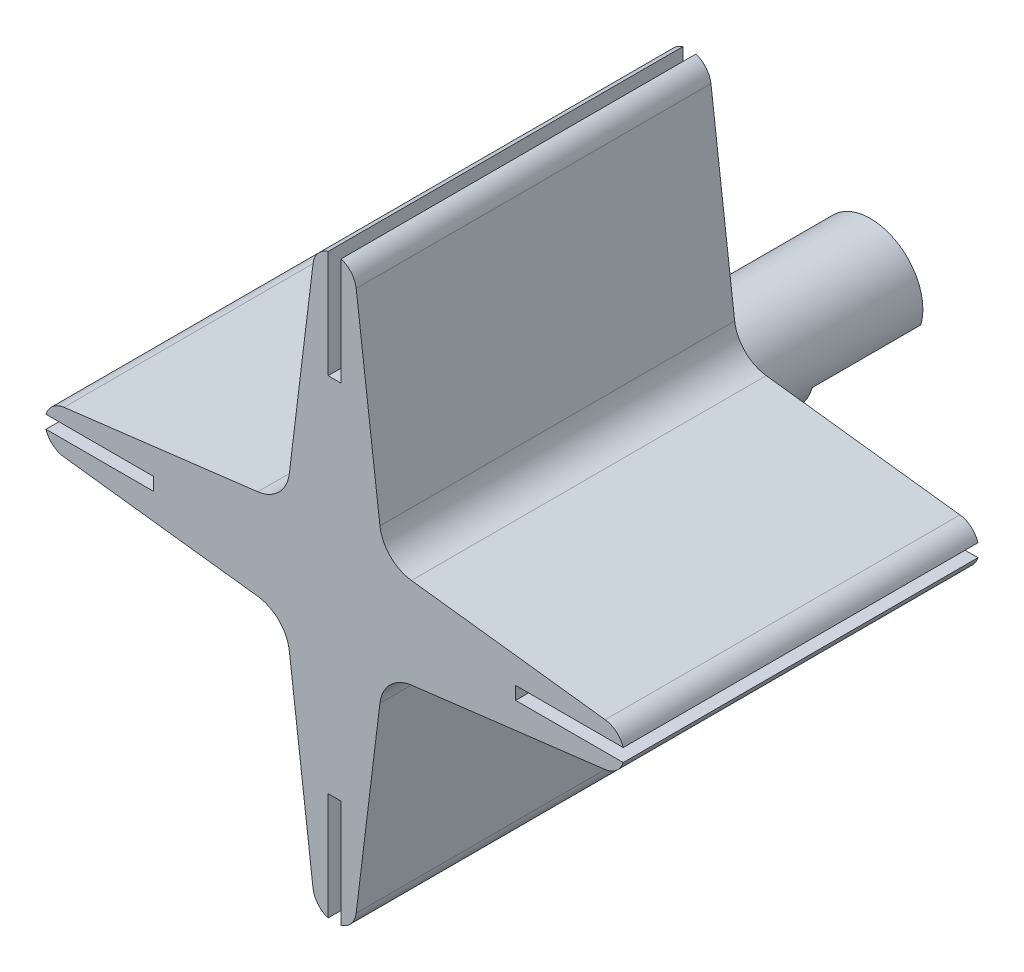
ISO-10303-21;
HEADER;
FILE_DESCRIPTION(('STEP AP214'),'2;1');
FILE_NAME('part.step','',(''),(''),'','','');
FILE_SCHEMA(('AUTOMOTIVE_DESIGN { 1 0 10303 214 1 1 1 1 }'));
ENDSEC;
DATA;
#1=APPLICATION_CONTEXT('core data for automotive mechanical design processes');
#2=APPLICATION_PROTOCOL_DEFINITION('international standard','automotive_design',2000,#1);
#3=PRODUCT_CONTEXT('',#1,'mechanical');
#4=PRODUCT('Part','Part','',(#3));
#5=PRODUCT_RELATED_PRODUCT_CATEGORY('part','',(#4));
#6=PRODUCT_DEFINITION_FORMATION('','',#4);
#7=PRODUCT_DEFINITION_CONTEXT('part definition',#1,'design');
#8=PRODUCT_DEFINITION('design','',#6,#7);
#9=PRODUCT_DEFINITION_SHAPE('','',#8);
#10=(LENGTH_UNIT() NAMED_UNIT(*) SI_UNIT(.MILLI.,.METRE.));
#11=(NAMED_UNIT(*) PLANE_ANGLE_UNIT() SI_UNIT($,.RADIAN.));
#12=(NAMED_UNIT(*) SI_UNIT($,.STERADIAN.) SOLID_ANGLE_UNIT());
#13=UNCERTAINTY_MEASURE_WITH_UNIT(LENGTH_MEASURE(1.E-05),#10,'distance_accuracy_value','');
#14=(GEOMETRIC_REPRESENTATION_CONTEXT(3) GLOBAL_UNCERTAINTY_ASSIGNED_CONTEXT((#13)) GLOBAL_UNIT_ASSIGNED_CONTEXT((#10,
#11,#12)) REPRESENTATION_CONTEXT('',''));
#15=CARTESIAN_POINT('',(0.,0.,0.));
#16=DIRECTION('',(0.,0.,1.));
#17=DIRECTION('',(1.,0.,0.));
#18=AXIS2_PLACEMENT_3D('',#15,#16,#17);
#19=CARTESIAN_POINT('',(-37.,0.,49.));
#20=DIRECTION('',(0.,0.,-1.));
#21=DIRECTION('',(-1.,0.,0.));
#22=AXIS2_PLACEMENT_3D('',#19,#20,#21);
#23=CYLINDRICAL_SURFACE('',#22,3.);
#24=DIRECTION('',(0.,0.,-1.));
#25=VECTOR('',#24,1.);
#26=CARTESIAN_POINT('',(-39.8637756437095,0.893749999997804,49.));
#27=LINE('',#26,#25);
#28=CARTESIAN_POINT('',(-39.8637756437095,0.893749999997805,49.));
#29=VERTEX_POINT('',#28);
#30=CARTESIAN_POINT('',(-39.8637756437095,0.893749999997805,0.));
#31=VERTEX_POINT('',#30);
#32=EDGE_CURVE('E340',#29,#31,#27,.T.);
#33=ORIENTED_EDGE('',*,*,#32,.F.);
#34=CARTESIAN_POINT('',(-37.,0.,49.));
#35=DIRECTION('',(0.,0.,1.));
#36=DIRECTION('',(1.,0.,0.));
#37=AXIS2_PLACEMENT_3D('',#34,#35,#36);
#38=CIRCLE('',#37,3.);
#39=CARTESIAN_POINT('',(-37.3648648648649,2.97772961001954,49.));
#40=VERTEX_POINT('',#39);
#41=EDGE_CURVE('E373',#29,#40,#38,.F.);
#42=ORIENTED_EDGE('',*,*,#41,.T.);
#43=DIRECTION('',(0.,0.,-1.));
#44=VECTOR('',#43,1.);
#45=CARTESIAN_POINT('',(-37.3648648648649,2.97772961001954,49.));
#46=LINE('',#45,#44);
#47=CARTESIAN_POINT('',(-37.3648648648649,2.97772961001954,0.));
#48=VERTEX_POINT('',#47);
#49=EDGE_CURVE('E404',#40,#48,#46,.T.);
#50=ORIENTED_EDGE('',*,*,#49,.T.);
#51=CARTESIAN_POINT('',(-37.,0.,0.));
#52=DIRECTION('',(0.,0.,1.));
#53=DIRECTION('',(1.,0.,0.));
#54=AXIS2_PLACEMENT_3D('',#51,#52,#53);
#55=CIRCLE('',#54,3.);
#56=EDGE_CURVE('E368',#31,#48,#55,.F.);
#57=ORIENTED_EDGE('',*,*,#56,.F.);
#58=EDGE_LOOP('',(#33,#42,#50,#57));
#59=FACE_BOUND('',#58,.T.);
#60=ADVANCED_FACE('F41',(#59),#23,.T.);
#61=CARTESIAN_POINT('',(0.,-37.,49.));
#62=DIRECTION('',(0.,0.,-1.));
#63=DIRECTION('',(-1.,0.,0.));
#64=AXIS2_PLACEMENT_3D('',#61,#62,#63);
#65=CYLINDRICAL_SURFACE('',#64,3.);
#66=DIRECTION('',(0.,0.,-1.));
#67=VECTOR('',#66,1.);
#68=CARTESIAN_POINT('',(-0.89374999999544,-39.8637756437103,49.));
#69=LINE('',#68,#67);
#70=CARTESIAN_POINT('',(-0.89374999999544,-39.8637756437103,49.));
#71=VERTEX_POINT('',#70);
#72=CARTESIAN_POINT('',(-0.89374999999544,-39.8637756437103,0.));
#73=VERTEX_POINT('',#72);
#74=EDGE_CURVE('E344',#71,#73,#69,.T.);
#75=ORIENTED_EDGE('',*,*,#74,.F.);
#76=CARTESIAN_POINT('',(0.,-37.,49.));
#77=DIRECTION('',(0.,0.,1.));
#78=DIRECTION('',(1.,0.,0.));
#79=AXIS2_PLACEMENT_3D('',#76,#77,#78);
#80=CIRCLE('',#79,3.);
#81=CARTESIAN_POINT('',(-2.97772961001954,-37.3648648648649,49.));
#82=VERTEX_POINT('',#81);
#83=EDGE_CURVE('E378',#71,#82,#80,.F.);
#84=ORIENTED_EDGE('',*,*,#83,.T.);
#85=DIRECTION('',(0.,0.,-1.));
#86=VECTOR('',#85,1.);
#87=CARTESIAN_POINT('',(-2.97772961001954,-37.3648648648649,49.));
#88=LINE('',#87,#86);
#89=CARTESIAN_POINT('',(-2.97772961001954,-37.3648648648649,0.));
#90=VERTEX_POINT('',#89);
#91=EDGE_CURVE('E457',#82,#90,#88,.T.);
#92=ORIENTED_EDGE('',*,*,#91,.T.);
#93=CARTESIAN_POINT('',(0.,-37.,0.));
#94=DIRECTION('',(0.,0.,1.));
#95=DIRECTION('',(1.,0.,0.));
#96=AXIS2_PLACEMENT_3D('',#93,#94,#95);
#97=CIRCLE('',#96,3.);
#98=EDGE_CURVE('E413',#73,#90,#97,.F.);
#99=ORIENTED_EDGE('',*,*,#98,.F.);
#100=EDGE_LOOP('',(#75,#84,#92,#99));
#101=FACE_BOUND('',#100,.T.);
#102=ADVANCED_FACE('F555',(#101),#65,.T.);
#103=CARTESIAN_POINT('',(37.,0.,49.));
#104=DIRECTION('',(0.,0.,-1.));
#105=DIRECTION('',(-1.,0.,0.));
#106=AXIS2_PLACEMENT_3D('',#103,#104,#105);
#107=CYLINDRICAL_SURFACE('',#106,3.);
#108=DIRECTION('',(0.,0.,-1.));
#109=VECTOR('',#108,1.);
#110=CARTESIAN_POINT('',(39.8637756437096,-0.893749999997629,49.));
#111=LINE('',#110,#109);
#112=CARTESIAN_POINT('',(39.8637756437096,-0.893749999997629,49.));
#113=VERTEX_POINT('',#112);
#114=CARTESIAN_POINT('',(39.8637756437096,-0.893749999997629,0.));
#115=VERTEX_POINT('',#114);
#116=EDGE_CURVE('E348',#113,#115,#111,.T.);
#117=ORIENTED_EDGE('',*,*,#116,.F.);
#118=CARTESIAN_POINT('',(37.,0.,49.));
#119=DIRECTION('',(0.,0.,1.));
#120=DIRECTION('',(1.,0.,0.));
#121=AXIS2_PLACEMENT_3D('',#118,#119,#120);
#122=CIRCLE('',#121,3.);
#123=CARTESIAN_POINT('',(37.3648648648649,-2.97772961001954,49.));
#124=VERTEX_POINT('',#123);
#125=EDGE_CURVE('E387',#113,#124,#122,.F.);
#126=ORIENTED_EDGE('',*,*,#125,.T.);
#127=DIRECTION('',(0.,0.,-1.));
#128=VECTOR('',#127,1.);
#129=CARTESIAN_POINT('',(37.3648648648649,-2.97772961001954,49.));
#130=LINE('',#129,#128);
#131=CARTESIAN_POINT('',(37.3648648648649,-2.97772961001954,0.));
#132=VERTEX_POINT('',#131);
#133=EDGE_CURVE('E451',#124,#132,#130,.T.);
#134=ORIENTED_EDGE('',*,*,#133,.T.);
#135=CARTESIAN_POINT('',(37.,0.,0.));
#136=DIRECTION('',(0.,0.,1.));
#137=DIRECTION('',(1.,0.,0.));
#138=AXIS2_PLACEMENT_3D('',#135,#136,#137);
#139=CIRCLE('',#138,3.);
#140=EDGE_CURVE('E422',#115,#132,#139,.F.);
#141=ORIENTED_EDGE('',*,*,#140,.F.);
#142=EDGE_LOOP('',(#117,#126,#134,#141));
#143=FACE_BOUND('',#142,.T.);
#144=ADVANCED_FACE('F518',(#143),#107,.T.);
#145=CARTESIAN_POINT('',(0.,37.,49.));
#146=DIRECTION('',(0.,0.,-1.));
#147=DIRECTION('',(-1.,0.,0.));
#148=AXIS2_PLACEMENT_3D('',#145,#146,#147);
#149=CYLINDRICAL_SURFACE('',#148,3.);
#150=DIRECTION('',(0.,0.,-1.));
#151=VECTOR('',#150,1.);
#152=CARTESIAN_POINT('',(-0.893749999999999,39.8637756437088,49.));
#153=LINE('',#152,#151);
#154=CARTESIAN_POINT('',(-0.893749999999999,39.8637756437088,0.));
#155=VERTEX_POINT('',#154);
#156=CARTESIAN_POINT('',(-0.893749999999999,39.8637756437088,49.));
#157=VERTEX_POINT('',#156);
#158=EDGE_CURVE('E268',#155,#157,#153,.F.);
#159=ORIENTED_EDGE('',*,*,#158,.F.);
#160=CARTESIAN_POINT('',(0.,37.,0.));
#161=DIRECTION('',(0.,0.,1.));
#162=DIRECTION('',(1.,0.,0.));
#163=AXIS2_PLACEMENT_3D('',#160,#161,#162);
#164=CIRCLE('',#163,3.);
#165=CARTESIAN_POINT('',(-2.97772961001954,37.3648648648649,0.));
#166=VERTEX_POINT('',#165);
#167=EDGE_CURVE('E432',#166,#155,#164,.F.);
#168=ORIENTED_EDGE('',*,*,#167,.F.);
#169=DIRECTION('',(0.,0.,-1.));
#170=VECTOR('',#169,1.);
#171=CARTESIAN_POINT('',(-2.97772961001954,37.3648648648649,49.));
#172=LINE('',#171,#170);
#173=CARTESIAN_POINT('',(-2.97772961001954,37.3648648648649,49.));
#174=VERTEX_POINT('',#173);
#175=EDGE_CURVE('E442',#174,#166,#172,.T.);
#176=ORIENTED_EDGE('',*,*,#175,.F.);
#177=CARTESIAN_POINT('',(0.,37.,49.));
#178=DIRECTION('',(0.,0.,1.));
#179=DIRECTION('',(1.,0.,0.));
#180=AXIS2_PLACEMENT_3D('',#177,#178,#179);
#181=CIRCLE('',#180,3.);
#182=EDGE_CURVE('E397',#174,#157,#181,.F.);
#183=ORIENTED_EDGE('',*,*,#182,.T.);
#184=EDGE_LOOP('',(#159,#168,#176,#183));
#185=FACE_BOUND('',#184,.T.);
#186=ADVANCED_FACE('F610',(#185),#149,.T.);
#187=DIRECTION('',(0.,0.,-1.));
#188=VECTOR('',#187,1.);
#189=CARTESIAN_POINT('',(-39.8637756437082,-0.893750000002193,49.));
#190=LINE('',#189,#188);
#191=CARTESIAN_POINT('',(-39.8637756437082,-0.893750000002193,0.));
#192=VERTEX_POINT('',#191);
#193=CARTESIAN_POINT('',(-39.8637756437082,-0.893750000002193,49.));
#194=VERTEX_POINT('',#193);
#195=EDGE_CURVE('E291',#192,#194,#190,.F.);
#196=ORIENTED_EDGE('',*,*,#195,.F.);
#197=CARTESIAN_POINT('',(-37.3648648648649,-2.97772961001955,0.));
#198=VERTEX_POINT('',#197);
#199=EDGE_CURVE('E405',#198,#192,#55,.F.);
#200=ORIENTED_EDGE('',*,*,#199,.F.);
#201=DIRECTION('',(0.,0.,-1.));
#202=VECTOR('',#201,1.);
#203=CARTESIAN_POINT('',(-37.3648648648649,-2.97772961001955,49.));
#204=LINE('',#203,#202);
#205=CARTESIAN_POINT('',(-37.3648648648649,-2.97772961001955,49.));
#206=VERTEX_POINT('',#205);
#207=EDGE_CURVE('E460',#206,#198,#204,.T.);
#208=ORIENTED_EDGE('',*,*,#207,.F.);
#209=EDGE_CURVE('E369',#206,#194,#38,.F.);
#210=ORIENTED_EDGE('',*,*,#209,.T.);
#211=EDGE_LOOP('',(#196,#200,#208,#210));
#212=FACE_BOUND('',#211,.T.);
#213=ADVANCED_FACE('F577',(#212),#23,.T.);
#214=CARTESIAN_POINT('',(-0.91216216216216,-7.44432402504886,49.));
#215=DIRECTION('',(-0.121621621621621,-0.992576536673181,0.));
#216=DIRECTION('',(0.992576536673181,-0.121621621621621,0.));
#217=AXIS2_PLACEMENT_3D('',#214,#215,#216);
#218=PLANE('',#217);
#219=DIRECTION('',(-0.992576536673181,0.121621621621621,0.));
#220=VECTOR('',#219,1.);
#221=CARTESIAN_POINT('',(-0.91216216216216,-7.44432402504886,0.));
#222=LINE('',#221,#220);
#223=CARTESIAN_POINT('',(-10.610722139404,-6.25594756414619,0.));
#224=VERTEX_POINT('',#223);
#225=EDGE_CURVE('E408',#224,#198,#222,.T.);
#226=ORIENTED_EDGE('',*,*,#225,.F.);
#227=DIRECTION('',(0.,0.,-1.));
#228=VECTOR('',#227,1.);
#229=CARTESIAN_POINT('',(-10.610722139404,-6.25594756414619,49.));
#230=LINE('',#229,#228);
#231=CARTESIAN_POINT('',(-10.610722139404,-6.25594756414619,49.));
#232=VERTEX_POINT('',#231);
#233=EDGE_CURVE('E471',#224,#232,#230,.F.);
#234=ORIENTED_EDGE('',*,*,#233,.T.);
#235=DIRECTION('',(-0.992576536673181,0.121621621621621,0.));
#236=VECTOR('',#235,1.);
#237=CARTESIAN_POINT('',(-0.91216216216216,-7.44432402504886,49.));
#238=LINE('',#237,#236);
#239=EDGE_CURVE('E372',#232,#206,#238,.T.);
#240=ORIENTED_EDGE('',*,*,#239,.T.);
#241=ORIENTED_EDGE('',*,*,#207,.T.);
#242=EDGE_LOOP('',(#226,#234,#240,#241));
#243=FACE_BOUND('',#242,.T.);
#244=ADVANCED_FACE('F567',(#243),#218,.T.);
#245=CARTESIAN_POINT('',(-7.44432402504886,-0.912162162162163,49.));
#246=DIRECTION('',(-0.992576536673181,-0.121621621621622,0.));
#247=DIRECTION('',(0.121621621621622,-0.992576536673181,0.));
#248=AXIS2_PLACEMENT_3D('',#245,#246,#247);
#249=PLANE('',#248);
#250=DIRECTION('',(-0.121621621621622,0.992576536673181,0.));
#251=VECTOR('',#250,1.);
#252=CARTESIAN_POINT('',(-7.44432402504886,-0.912162162162163,49.));
#253=LINE('',#252,#251);
#254=CARTESIAN_POINT('',(-6.25594756414618,-10.610722139404,49.));
#255=VERTEX_POINT('',#254);
#256=EDGE_CURVE('E375',#82,#255,#253,.T.);
#257=ORIENTED_EDGE('',*,*,#256,.T.);
#258=DIRECTION('',(0.,0.,-1.));
#259=VECTOR('',#258,1.);
#260=CARTESIAN_POINT('',(-6.25594756414618,-10.610722139404,0.));
#261=LINE('',#260,#259);
#262=CARTESIAN_POINT('',(-6.25594756414618,-10.610722139404,0.));
#263=VERTEX_POINT('',#262);
#264=EDGE_CURVE('E468',#255,#263,#261,.T.);
#265=ORIENTED_EDGE('',*,*,#264,.T.);
#266=DIRECTION('',(-0.121621621621622,0.992576536673181,0.));
#267=VECTOR('',#266,1.);
#268=CARTESIAN_POINT('',(-7.44432402504886,-0.912162162162163,0.));
#269=LINE('',#268,#267);
#270=EDGE_CURVE('E410',#90,#263,#269,.T.);
#271=ORIENTED_EDGE('',*,*,#270,.F.);
#272=ORIENTED_EDGE('',*,*,#91,.F.);
#273=EDGE_LOOP('',(#257,#265,#271,#272));
#274=FACE_BOUND('',#273,.T.);
#275=ADVANCED_FACE('F561',(#274),#249,.T.);
#276=DIRECTION('',(0.,0.,-1.));
#277=VECTOR('',#276,1.);
#278=CARTESIAN_POINT('',(0.893750000004557,-39.8637756437074,49.));
#279=LINE('',#278,#277);
#280=CARTESIAN_POINT('',(0.893750000004557,-39.8637756437074,0.));
#281=VERTEX_POINT('',#280);
#282=CARTESIAN_POINT('',(0.893750000004557,-39.8637756437074,49.));
#283=VERTEX_POINT('',#282);
#284=EDGE_CURVE('E342',#281,#283,#279,.F.);
#285=ORIENTED_EDGE('',*,*,#284,.F.);
#286=CARTESIAN_POINT('',(2.97772961001955,-37.3648648648649,0.));
#287=VERTEX_POINT('',#286);
#288=EDGE_CURVE('E414',#287,#281,#97,.F.);
#289=ORIENTED_EDGE('',*,*,#288,.F.);
#290=DIRECTION('',(0.,0.,-1.));
#291=VECTOR('',#290,1.);
#292=CARTESIAN_POINT('',(2.97772961001955,-37.3648648648649,49.));
#293=LINE('',#292,#291);
#294=CARTESIAN_POINT('',(2.97772961001955,-37.3648648648649,49.));
#295=VERTEX_POINT('',#294);
#296=EDGE_CURVE('E454',#295,#287,#293,.T.);
#297=ORIENTED_EDGE('',*,*,#296,.F.);
#298=EDGE_CURVE('E379',#295,#283,#80,.F.);
#299=ORIENTED_EDGE('',*,*,#298,.T.);
#300=EDGE_LOOP('',(#285,#289,#297,#299));
#301=FACE_BOUND('',#300,.T.);
#302=ADVANCED_FACE('F540',(#301),#65,.T.);
#303=CARTESIAN_POINT('',(7.44432402504886,-0.912162162162161,49.));
#304=DIRECTION('',(0.992576536673181,-0.121621621621621,0.));
#305=DIRECTION('',(0.121621621621621,0.992576536673181,0.));
#306=AXIS2_PLACEMENT_3D('',#303,#304,#305);
#307=PLANE('',#306);
#308=DIRECTION('',(-0.121621621621621,-0.992576536673181,0.));
#309=VECTOR('',#308,1.);
#310=CARTESIAN_POINT('',(7.44432402504886,-0.912162162162161,0.));
#311=LINE('',#310,#309);
#312=CARTESIAN_POINT('',(6.25594756414619,-10.610722139404,0.));
#313=VERTEX_POINT('',#312);
#314=EDGE_CURVE('E417',#313,#287,#311,.T.);
#315=ORIENTED_EDGE('',*,*,#314,.F.);
#316=DIRECTION('',(0.,0.,-1.));
#317=VECTOR('',#316,1.);
#318=CARTESIAN_POINT('',(6.25594756414619,-10.610722139404,49.));
#319=LINE('',#318,#317);
#320=CARTESIAN_POINT('',(6.25594756414619,-10.610722139404,49.));
#321=VERTEX_POINT('',#320);
#322=EDGE_CURVE('E466',#313,#321,#319,.F.);
#323=ORIENTED_EDGE('',*,*,#322,.T.);
#324=DIRECTION('',(-0.121621621621621,-0.992576536673181,0.));
#325=VECTOR('',#324,1.);
#326=CARTESIAN_POINT('',(7.44432402504886,-0.912162162162161,49.));
#327=LINE('',#326,#325);
#328=EDGE_CURVE('E382',#321,#295,#327,.T.);
#329=ORIENTED_EDGE('',*,*,#328,.T.);
#330=ORIENTED_EDGE('',*,*,#296,.T.);
#331=EDGE_LOOP('',(#315,#323,#329,#330));
#332=FACE_BOUND('',#331,.T.);
#333=ADVANCED_FACE('F530',(#332),#307,.T.);
#334=CARTESIAN_POINT('',(0.912162162162166,-7.44432402504887,49.));
#335=DIRECTION('',(0.121621621621622,-0.992576536673181,0.));
#336=DIRECTION('',(0.992576536673181,0.121621621621622,0.));
#337=AXIS2_PLACEMENT_3D('',#334,#335,#336);
#338=PLANE('',#337);
#339=DIRECTION('',(-0.992576536673181,-0.121621621621622,0.));
#340=VECTOR('',#339,1.);
#341=CARTESIAN_POINT('',(0.912162162162166,-7.44432402504887,49.));
#342=LINE('',#341,#340);
#343=CARTESIAN_POINT('',(10.610722139404,-6.25594756414619,49.));
#344=VERTEX_POINT('',#343);
#345=EDGE_CURVE('E384',#124,#344,#342,.T.);
#346=ORIENTED_EDGE('',*,*,#345,.T.);
#347=DIRECTION('',(0.,0.,-1.));
#348=VECTOR('',#347,1.);
#349=CARTESIAN_POINT('',(10.610722139404,-6.25594756414619,0.));
#350=LINE('',#349,#348);
#351=CARTESIAN_POINT('',(10.610722139404,-6.25594756414619,0.));
#352=VERTEX_POINT('',#351);
#353=EDGE_CURVE('E463',#344,#352,#350,.T.);
#354=ORIENTED_EDGE('',*,*,#353,.T.);
#355=DIRECTION('',(-0.992576536673181,-0.121621621621622,0.));
#356=VECTOR('',#355,1.);
#357=CARTESIAN_POINT('',(0.912162162162166,-7.44432402504887,0.));
#358=LINE('',#357,#356);
#359=EDGE_CURVE('E419',#132,#352,#358,.T.);
#360=ORIENTED_EDGE('',*,*,#359,.F.);
#361=ORIENTED_EDGE('',*,*,#133,.F.);
#362=EDGE_LOOP('',(#346,#354,#360,#361));
#363=FACE_BOUND('',#362,.T.);
#364=ADVANCED_FACE('F524',(#363),#338,.T.);
#365=DIRECTION('',(0.,0.,-1.));
#366=VECTOR('',#365,1.);
#367=CARTESIAN_POINT('',(39.8637756437081,0.893750000002368,49.));
#368=LINE('',#367,#366);
#369=CARTESIAN_POINT('',(39.8637756437081,0.893750000002368,0.));
#370=VERTEX_POINT('',#369);
#371=CARTESIAN_POINT('',(39.8637756437081,0.893750000002368,49.));
#372=VERTEX_POINT('',#371);
#373=EDGE_CURVE('E346',#370,#372,#368,.F.);
#374=ORIENTED_EDGE('',*,*,#373,.F.);
#375=CARTESIAN_POINT('',(37.3648648648649,2.97772961001955,0.));
#376=VERTEX_POINT('',#375);
#377=EDGE_CURVE('E423',#376,#370,#139,.F.);
#378=ORIENTED_EDGE('',*,*,#377,.F.);
#379=DIRECTION('',(0.,0.,-1.));
#380=VECTOR('',#379,1.);
#381=CARTESIAN_POINT('',(37.3648648648649,2.97772961001955,49.));
#382=LINE('',#381,#380);
#383=CARTESIAN_POINT('',(37.3648648648649,2.97772961001955,49.));
#384=VERTEX_POINT('',#383);
#385=EDGE_CURVE('E448',#384,#376,#382,.T.);
#386=ORIENTED_EDGE('',*,*,#385,.F.);
#387=EDGE_CURVE('E388',#384,#372,#122,.F.);
#388=ORIENTED_EDGE('',*,*,#387,.T.);
#389=EDGE_LOOP('',(#374,#378,#386,#388));
#390=FACE_BOUND('',#389,.T.);
#391=ADVANCED_FACE('F635',(#390),#107,.T.);
#392=CARTESIAN_POINT('',(0.912162162162162,7.44432402504886,49.));
#393=DIRECTION('',(0.121621621621622,0.992576536673181,0.));
#394=DIRECTION('',(-0.992576536673181,0.121621621621622,0.));
#395=AXIS2_PLACEMENT_3D('',#392,#393,#394);
#396=PLANE('',#395);
#397=DIRECTION('',(0.992576536673181,-0.121621621621622,0.));
#398=VECTOR('',#397,1.);
#399=CARTESIAN_POINT('',(0.912162162162162,7.44432402504886,0.));
#400=LINE('',#399,#398);
#401=CARTESIAN_POINT('',(10.610722139404,6.25594756414619,0.));
#402=VERTEX_POINT('',#401);
#403=EDGE_CURVE('E426',#402,#376,#400,.T.);
#404=ORIENTED_EDGE('',*,*,#403,.F.);
#405=DIRECTION('',(0.,0.,-1.));
#406=VECTOR('',#405,1.);
#407=CARTESIAN_POINT('',(10.610722139404,6.25594756414619,49.));
#408=LINE('',#407,#406);
#409=CARTESIAN_POINT('',(10.610722139404,6.25594756414619,49.));
#410=VERTEX_POINT('',#409);
#411=EDGE_CURVE('E481',#402,#410,#408,.F.);
#412=ORIENTED_EDGE('',*,*,#411,.T.);
#413=DIRECTION('',(0.992576536673181,-0.121621621621622,0.));
#414=VECTOR('',#413,1.);
#415=CARTESIAN_POINT('',(0.912162162162162,7.44432402504886,49.));
#416=LINE('',#415,#414);
#417=EDGE_CURVE('E391',#410,#384,#416,.T.);
#418=ORIENTED_EDGE('',*,*,#417,.T.);
#419=ORIENTED_EDGE('',*,*,#385,.T.);
#420=EDGE_LOOP('',(#404,#412,#418,#419));
#421=FACE_BOUND('',#420,.T.);
#422=ADVANCED_FACE('F626',(#421),#396,.T.);
#423=CARTESIAN_POINT('',(7.44432402504886,0.912162162162161,49.));
#424=DIRECTION('',(0.992576536673181,0.121621621621622,0.));
#425=DIRECTION('',(-0.121621621621622,0.992576536673181,0.));
#426=AXIS2_PLACEMENT_3D('',#423,#424,#425);
#427=PLANE('',#426);
#428=DIRECTION('',(0.121621621621622,-0.992576536673181,0.));
#429=VECTOR('',#428,1.);
#430=CARTESIAN_POINT('',(7.44432402504886,0.912162162162161,49.));
#431=LINE('',#430,#429);
#432=CARTESIAN_POINT('',(2.97772961001954,37.3648648648649,49.));
#433=VERTEX_POINT('',#432);
#434=CARTESIAN_POINT('',(6.25594756414618,10.610722139404,49.));
#435=VERTEX_POINT('',#434);
#436=EDGE_CURVE('E393',#433,#435,#431,.T.);
#437=ORIENTED_EDGE('',*,*,#436,.T.);
#438=DIRECTION('',(0.,0.,-1.));
#439=VECTOR('',#438,1.);
#440=CARTESIAN_POINT('',(6.25594756414618,10.610722139404,0.));
#441=LINE('',#440,#439);
#442=CARTESIAN_POINT('',(6.25594756414618,10.610722139404,0.));
#443=VERTEX_POINT('',#442);
#444=EDGE_CURVE('E478',#435,#443,#441,.T.);
#445=ORIENTED_EDGE('',*,*,#444,.T.);
#446=DIRECTION('',(0.121621621621622,-0.992576536673181,0.));
#447=VECTOR('',#446,1.);
#448=CARTESIAN_POINT('',(7.44432402504886,0.912162162162161,0.));
#449=LINE('',#448,#447);
#450=CARTESIAN_POINT('',(2.97772961001954,37.3648648648649,0.));
#451=VERTEX_POINT('',#450);
#452=EDGE_CURVE('E428',#451,#443,#449,.T.);
#453=ORIENTED_EDGE('',*,*,#452,.F.);
#454=DIRECTION('',(0.,0.,-1.));
#455=VECTOR('',#454,1.);
#456=CARTESIAN_POINT('',(2.97772961001954,37.3648648648649,49.));
#457=LINE('',#456,#455);
#458=EDGE_CURVE('E445',#433,#451,#457,.T.);
#459=ORIENTED_EDGE('',*,*,#458,.F.);
#460=EDGE_LOOP('',(#437,#445,#453,#459));
#461=FACE_BOUND('',#460,.T.);
#462=ADVANCED_FACE('F620',(#461),#427,.T.);
#463=DIRECTION('',(0.,0.,-1.));
#464=VECTOR('',#463,1.);
#465=CARTESIAN_POINT('',(0.893749999999999,39.8637756437088,49.));
#466=LINE('',#465,#464);
#467=CARTESIAN_POINT('',(0.893749999999999,39.8637756437088,49.));
#468=VERTEX_POINT('',#467);
#469=CARTESIAN_POINT('',(0.893749999999999,39.8637756437088,0.));
#470=VERTEX_POINT('',#469);
#471=EDGE_CURVE('E350',#468,#470,#466,.T.);
#472=ORIENTED_EDGE('',*,*,#471,.F.);
#473=EDGE_CURVE('E396',#468,#433,#181,.F.);
#474=ORIENTED_EDGE('',*,*,#473,.T.);
#475=ORIENTED_EDGE('',*,*,#458,.T.);
#476=EDGE_CURVE('E431',#470,#451,#164,.F.);
#477=ORIENTED_EDGE('',*,*,#476,.F.);
#478=EDGE_LOOP('',(#472,#474,#475,#477));
#479=FACE_BOUND('',#478,.T.);
#480=ADVANCED_FACE('F615',(#479),#149,.T.);
#481=CARTESIAN_POINT('',(-7.44432402504886,0.912162162162163,49.));
#482=DIRECTION('',(-0.992576536673181,0.121621621621622,0.));
#483=DIRECTION('',(-0.121621621621622,-0.992576536673181,0.));
#484=AXIS2_PLACEMENT_3D('',#481,#482,#483);
#485=PLANE('',#484);
#486=DIRECTION('',(0.121621621621622,0.992576536673181,0.));
#487=VECTOR('',#486,1.);
#488=CARTESIAN_POINT('',(-7.44432402504886,0.912162162162163,0.));
#489=LINE('',#488,#487);
#490=CARTESIAN_POINT('',(-6.25594756414619,10.610722139404,0.));
#491=VERTEX_POINT('',#490);
#492=EDGE_CURVE('E435',#491,#166,#489,.T.);
#493=ORIENTED_EDGE('',*,*,#492,.F.);
#494=DIRECTION('',(0.,0.,-1.));
#495=VECTOR('',#494,1.);
#496=CARTESIAN_POINT('',(-6.25594756414619,10.610722139404,49.));
#497=LINE('',#496,#495);
#498=CARTESIAN_POINT('',(-6.25594756414619,10.610722139404,49.));
#499=VERTEX_POINT('',#498);
#500=EDGE_CURVE('E476',#491,#499,#497,.F.);
#501=ORIENTED_EDGE('',*,*,#500,.T.);
#502=DIRECTION('',(0.121621621621622,0.992576536673181,0.));
#503=VECTOR('',#502,1.);
#504=CARTESIAN_POINT('',(-7.44432402504886,0.912162162162163,49.));
#505=LINE('',#504,#503);
#506=EDGE_CURVE('E399',#499,#174,#505,.T.);
#507=ORIENTED_EDGE('',*,*,#506,.T.);
#508=ORIENTED_EDGE('',*,*,#175,.T.);
#509=EDGE_LOOP('',(#493,#501,#507,#508));
#510=FACE_BOUND('',#509,.T.);
#511=ADVANCED_FACE('F603',(#510),#485,.T.);
#512=CARTESIAN_POINT('',(-0.912162162162166,7.44432402504887,49.));
#513=DIRECTION('',(-0.121621621621622,0.992576536673181,0.));
#514=DIRECTION('',(-0.992576536673181,-0.121621621621622,0.));
#515=AXIS2_PLACEMENT_3D('',#512,#513,#514);
#516=PLANE('',#515);
#517=DIRECTION('',(0.992576536673181,0.121621621621622,0.));
#518=VECTOR('',#517,1.);
#519=CARTESIAN_POINT('',(-0.912162162162166,7.44432402504887,49.));
#520=LINE('',#519,#518);
#521=CARTESIAN_POINT('',(-10.610722139404,6.25594756414619,49.));
#522=VERTEX_POINT('',#521);
#523=EDGE_CURVE('E401',#40,#522,#520,.T.);
#524=ORIENTED_EDGE('',*,*,#523,.T.);
#525=DIRECTION('',(0.,0.,-1.));
#526=VECTOR('',#525,1.);
#527=CARTESIAN_POINT('',(-10.610722139404,6.25594756414619,0.));
#528=LINE('',#527,#526);
#529=CARTESIAN_POINT('',(-10.610722139404,6.25594756414619,0.));
#530=VERTEX_POINT('',#529);
#531=EDGE_CURVE('E473',#522,#530,#528,.T.);
#532=ORIENTED_EDGE('',*,*,#531,.T.);
#533=DIRECTION('',(0.992576536673181,0.121621621621622,0.));
#534=VECTOR('',#533,1.);
#535=CARTESIAN_POINT('',(-0.912162162162166,7.44432402504887,0.));
#536=LINE('',#535,#534);
#537=EDGE_CURVE('E437',#48,#530,#536,.T.);
#538=ORIENTED_EDGE('',*,*,#537,.F.);
#539=ORIENTED_EDGE('',*,*,#49,.F.);
#540=EDGE_LOOP('',(#524,#532,#538,#539));
#541=FACE_BOUND('',#540,.T.);
#542=ADVANCED_FACE('F597',(#541),#516,.T.);
#543=CARTESIAN_POINT('',(0.,0.,49.));
#544=DIRECTION('',(0.,0.,1.));
#545=DIRECTION('',(1.,0.,0.));
#546=AXIS2_PLACEMENT_3D('',#543,#544,#545);
#547=PLANE('',#546);
#548=DIRECTION('',(0.,-1.,0.));
#549=VECTOR('',#548,1.);
#550=CARTESIAN_POINT('',(-0.89375,50.,49.));
#551=LINE('',#550,#549);
#552=CARTESIAN_POINT('',(-0.893749999999997,25.,49.));
#553=VERTEX_POINT('',#552);
#554=EDGE_CURVE('E262',#157,#553,#551,.T.);
#555=ORIENTED_EDGE('',*,*,#554,.F.);
#556=ORIENTED_EDGE('',*,*,#182,.F.);
#557=ORIENTED_EDGE('',*,*,#506,.F.);
#558=CARTESIAN_POINT('',(-11.2188302475121,11.2188302475121,49.));
#559=DIRECTION('',(0.,0.,1.));
#560=DIRECTION('',(1.,0.,0.));
#561=AXIS2_PLACEMENT_3D('',#558,#559,#560);
#562=CIRCLE('',#561,5.);
#563=EDGE_CURVE('E493',#499,#522,#562,.F.);
#564=ORIENTED_EDGE('',*,*,#563,.T.);
#565=ORIENTED_EDGE('',*,*,#523,.F.);
#566=ORIENTED_EDGE('',*,*,#41,.F.);
#567=DIRECTION('',(-1.,0.,0.));
#568=VECTOR('',#567,1.);
#569=CARTESIAN_POINT('',(-49.9999999999976,0.893749999997804,49.));
#570=LINE('',#569,#568);
#571=CARTESIAN_POINT('',(-24.9999999999976,0.893749999997805,49.));
#572=VERTEX_POINT('',#571);
#573=EDGE_CURVE('E329',#572,#29,#570,.T.);
#574=ORIENTED_EDGE('',*,*,#573,.F.);
#575=DIRECTION('',(0.,1.,0.));
#576=VECTOR('',#575,1.);
#577=CARTESIAN_POINT('',(-24.9999999999976,-0.893750000002188,49.));
#578=LINE('',#577,#576);
#579=CARTESIAN_POINT('',(-24.9999999999976,-0.893750000002188,49.));
#580=VERTEX_POINT('',#579);
#581=EDGE_CURVE('E333',#580,#572,#578,.T.);
#582=ORIENTED_EDGE('',*,*,#581,.F.);
#583=DIRECTION('',(1.,0.,0.));
#584=VECTOR('',#583,1.);
#585=CARTESIAN_POINT('',(-49.9999999999976,-0.893750000002196,49.));
#586=LINE('',#585,#584);
#587=EDGE_CURVE('E309',#194,#580,#586,.T.);
#588=ORIENTED_EDGE('',*,*,#587,.F.);
#589=ORIENTED_EDGE('',*,*,#209,.F.);
#590=ORIENTED_EDGE('',*,*,#239,.F.);
#591=CARTESIAN_POINT('',(-11.2188302475121,-11.2188302475121,49.));
#592=DIRECTION('',(0.,0.,1.));
#593=DIRECTION('',(1.,0.,0.));
#594=AXIS2_PLACEMENT_3D('',#591,#592,#593);
#595=CIRCLE('',#594,5.);
#596=EDGE_CURVE('E489',#232,#255,#595,.F.);
#597=ORIENTED_EDGE('',*,*,#596,.T.);
#598=ORIENTED_EDGE('',*,*,#256,.F.);
#599=ORIENTED_EDGE('',*,*,#83,.F.);
#600=DIRECTION('',(0.,-1.,0.));
#601=VECTOR('',#600,1.);
#602=CARTESIAN_POINT('',(-0.89374999999544,-49.9999999999998,49.));
#603=LINE('',#602,#601);
#604=CARTESIAN_POINT('',(-0.89374999999544,-24.9999999999998,49.));
#605=VERTEX_POINT('',#604);
#606=EDGE_CURVE('E313',#605,#71,#603,.T.);
#607=ORIENTED_EDGE('',*,*,#606,.F.);
#608=DIRECTION('',(-1.,0.,0.));
#609=VECTOR('',#608,1.);
#610=CARTESIAN_POINT('',(0.893750000004554,-24.9999999999998,49.));
#611=LINE('',#610,#609);
#612=CARTESIAN_POINT('',(0.893750000004554,-24.9999999999998,49.));
#613=VERTEX_POINT('',#612);
#614=EDGE_CURVE('E317',#613,#605,#611,.T.);
#615=ORIENTED_EDGE('',*,*,#614,.F.);
#616=DIRECTION('',(0.,1.,0.));
#617=VECTOR('',#616,1.);
#618=CARTESIAN_POINT('',(0.89375000000456,-49.9999999999998,49.));
#619=LINE('',#618,#617);
#620=EDGE_CURVE('E295',#283,#613,#619,.T.);
#621=ORIENTED_EDGE('',*,*,#620,.F.);
#622=ORIENTED_EDGE('',*,*,#298,.F.);
#623=ORIENTED_EDGE('',*,*,#328,.F.);
#624=CARTESIAN_POINT('',(11.2188302475121,-11.2188302475121,49.));
#625=DIRECTION('',(0.,0.,1.));
#626=DIRECTION('',(1.,0.,0.));
#627=AXIS2_PLACEMENT_3D('',#624,#625,#626);
#628=CIRCLE('',#627,5.);
#629=EDGE_CURVE('E485',#321,#344,#628,.F.);
#630=ORIENTED_EDGE('',*,*,#629,.T.);
#631=ORIENTED_EDGE('',*,*,#345,.F.);
#632=ORIENTED_EDGE('',*,*,#125,.F.);
#633=DIRECTION('',(1.,0.,0.));
#634=VECTOR('',#633,1.);
#635=CARTESIAN_POINT('',(50.0000000000022,-0.89374999999763,49.));
#636=LINE('',#635,#634);
#637=CARTESIAN_POINT('',(25.0000000000022,-0.893749999997628,49.));
#638=VERTEX_POINT('',#637);
#639=EDGE_CURVE('E297',#638,#113,#636,.T.);
#640=ORIENTED_EDGE('',*,*,#639,.F.);
#641=DIRECTION('',(0.,-1.,0.));
#642=VECTOR('',#641,1.);
#643=CARTESIAN_POINT('',(25.0000000000022,0.893750000002365,49.));
#644=LINE('',#643,#642);
#645=CARTESIAN_POINT('',(25.0000000000022,0.893750000002365,49.));
#646=VERTEX_POINT('',#645);
#647=EDGE_CURVE('E301',#646,#638,#644,.T.);
#648=ORIENTED_EDGE('',*,*,#647,.F.);
#649=DIRECTION('',(-1.,0.,0.));
#650=VECTOR('',#649,1.);
#651=CARTESIAN_POINT('',(50.0000000000022,0.89375000000237,49.));
#652=LINE('',#651,#650);
#653=EDGE_CURVE('E274',#372,#646,#652,.T.);
#654=ORIENTED_EDGE('',*,*,#653,.F.);
#655=ORIENTED_EDGE('',*,*,#387,.F.);
#656=ORIENTED_EDGE('',*,*,#417,.F.);
#657=CARTESIAN_POINT('',(11.2188302475121,11.2188302475121,49.));
#658=DIRECTION('',(0.,0.,1.));
#659=DIRECTION('',(1.,0.,0.));
#660=AXIS2_PLACEMENT_3D('',#657,#658,#659);
#661=CIRCLE('',#660,5.);
#662=EDGE_CURVE('E497',#410,#435,#661,.F.);
#663=ORIENTED_EDGE('',*,*,#662,.T.);
#664=ORIENTED_EDGE('',*,*,#436,.F.);
#665=ORIENTED_EDGE('',*,*,#473,.F.);
#666=DIRECTION('',(0.,1.,0.));
#667=VECTOR('',#666,1.);
#668=CARTESIAN_POINT('',(0.89375,50.,49.));
#669=LINE('',#668,#667);
#670=CARTESIAN_POINT('',(0.893749999999997,25.,49.));
#671=VERTEX_POINT('',#670);
#672=EDGE_CURVE('E280',#671,#468,#669,.T.);
#673=ORIENTED_EDGE('',*,*,#672,.F.);
#674=DIRECTION('',(1.,0.,0.));
#675=VECTOR('',#674,1.);
#676=CARTESIAN_POINT('',(-0.893749999999997,25.,49.));
#677=LINE('',#676,#675);
#678=EDGE_CURVE('E273',#553,#671,#677,.T.);
#679=ORIENTED_EDGE('',*,*,#678,.F.);
#680=EDGE_LOOP('',(#555,#556,#557,#564,#565,#566,#574,#582,#588,#589,#590,#597,#598,#599,#607,
#615,#621,#622,#623,#630,#631,#632,#640,#648,#654,#655,#656,#663,#664,#665,#673,#679));
#681=FACE_BOUND('',#680,.T.);
#682=ADVANCED_FACE('F282',(#681),#547,.T.);
#683=CARTESIAN_POINT('',(0.,0.,0.));
#684=DIRECTION('',(0.,0.,1.));
#685=DIRECTION('',(1.,0.,0.));
#686=AXIS2_PLACEMENT_3D('',#683,#684,#685);
#687=PLANE('',#686);
#688=ORIENTED_EDGE('',*,*,#167,.T.);
#689=DIRECTION('',(0.,1.,0.));
#690=VECTOR('',#689,1.);
#691=CARTESIAN_POINT('',(-0.89375,50.,0.));
#692=LINE('',#691,#690);
#693=CARTESIAN_POINT('',(-0.893749999999997,25.,0.));
#694=VERTEX_POINT('',#693);
#695=EDGE_CURVE('E288',#694,#155,#692,.T.);
#696=ORIENTED_EDGE('',*,*,#695,.F.);
#697=DIRECTION('',(-1.,0.,0.));
#698=VECTOR('',#697,1.);
#699=CARTESIAN_POINT('',(-0.893749999999997,25.,0.));
#700=LINE('',#699,#698);
#701=CARTESIAN_POINT('',(0.893749999999997,25.,0.));
#702=VERTEX_POINT('',#701);
#703=EDGE_CURVE('E279',#702,#694,#700,.T.);
#704=ORIENTED_EDGE('',*,*,#703,.F.);
#705=DIRECTION('',(0.,1.,0.));
#706=VECTOR('',#705,1.);
#707=CARTESIAN_POINT('',(0.893749999999994,0.,0.));
#708=LINE('',#707,#706);
#709=EDGE_CURVE('E11',#702,#470,#708,.T.);
#710=ORIENTED_EDGE('',*,*,#709,.T.);
#711=ORIENTED_EDGE('',*,*,#476,.T.);
#712=ORIENTED_EDGE('',*,*,#452,.T.);
#713=CARTESIAN_POINT('',(11.2188302475121,11.2188302475121,0.));
#714=DIRECTION('',(0.,0.,1.));
#715=DIRECTION('',(1.,0.,0.));
#716=AXIS2_PLACEMENT_3D('',#713,#714,#715);
#717=CIRCLE('',#716,5.);
#718=EDGE_CURVE('E495',#443,#402,#717,.T.);
#719=ORIENTED_EDGE('',*,*,#718,.T.);
#720=ORIENTED_EDGE('',*,*,#403,.T.);
#721=ORIENTED_EDGE('',*,*,#377,.T.);
#722=DIRECTION('',(1.,0.,0.));
#723=VECTOR('',#722,1.);
#724=CARTESIAN_POINT('',(50.0000000000022,0.89375000000237,0.));
#725=LINE('',#724,#723);
#726=CARTESIAN_POINT('',(25.0000000000022,0.893750000002365,0.));
#727=VERTEX_POINT('',#726);
#728=EDGE_CURVE('E292',#727,#370,#725,.T.);
#729=ORIENTED_EDGE('',*,*,#728,.F.);
#730=DIRECTION('',(0.,1.,0.));
#731=VECTOR('',#730,1.);
#732=CARTESIAN_POINT('',(25.0000000000022,0.893750000002365,0.));
#733=LINE('',#732,#731);
#734=CARTESIAN_POINT('',(25.0000000000022,-0.893749999997628,0.));
#735=VERTEX_POINT('',#734);
#736=EDGE_CURVE('E294',#735,#727,#733,.T.);
#737=ORIENTED_EDGE('',*,*,#736,.F.);
#738=DIRECTION('',(1.,0.,0.));
#739=VECTOR('',#738,1.);
#740=CARTESIAN_POINT('',(0.,-0.893749999997627,0.));
#741=LINE('',#740,#739);
#742=EDGE_CURVE('E49',#735,#115,#741,.T.);
#743=ORIENTED_EDGE('',*,*,#742,.T.);
#744=ORIENTED_EDGE('',*,*,#140,.T.);
#745=ORIENTED_EDGE('',*,*,#359,.T.);
#746=CARTESIAN_POINT('',(11.2188302475121,-11.2188302475121,0.));
#747=DIRECTION('',(0.,0.,1.));
#748=DIRECTION('',(1.,0.,0.));
#749=AXIS2_PLACEMENT_3D('',#746,#747,#748);
#750=CIRCLE('',#749,5.);
#751=EDGE_CURVE('E483',#352,#313,#750,.T.);
#752=ORIENTED_EDGE('',*,*,#751,.T.);
#753=ORIENTED_EDGE('',*,*,#314,.T.);
#754=ORIENTED_EDGE('',*,*,#288,.T.);
#755=DIRECTION('',(0.,-1.,0.));
#756=VECTOR('',#755,1.);
#757=CARTESIAN_POINT('',(0.89375000000456,-49.9999999999998,0.));
#758=LINE('',#757,#756);
#759=CARTESIAN_POINT('',(0.893750000004554,-24.9999999999998,0.));
#760=VERTEX_POINT('',#759);
#761=EDGE_CURVE('E306',#760,#281,#758,.T.);
#762=ORIENTED_EDGE('',*,*,#761,.F.);
#763=DIRECTION('',(1.,0.,0.));
#764=VECTOR('',#763,1.);
#765=CARTESIAN_POINT('',(0.893750000004554,-24.9999999999998,0.));
#766=LINE('',#765,#764);
#767=CARTESIAN_POINT('',(-0.89374999999544,-24.9999999999998,0.));
#768=VERTEX_POINT('',#767);
#769=EDGE_CURVE('E308',#768,#760,#766,.T.);
#770=ORIENTED_EDGE('',*,*,#769,.F.);
#771=DIRECTION('',(0.,-1.,0.));
#772=VECTOR('',#771,1.);
#773=CARTESIAN_POINT('',(-0.89374999999544,0.,0.));
#774=LINE('',#773,#772);
#775=EDGE_CURVE('E505',#768,#73,#774,.T.);
#776=ORIENTED_EDGE('',*,*,#775,.T.);
#777=ORIENTED_EDGE('',*,*,#98,.T.);
#778=ORIENTED_EDGE('',*,*,#270,.T.);
#779=CARTESIAN_POINT('',(-11.2188302475121,-11.2188302475121,0.));
#780=DIRECTION('',(0.,0.,1.));
#781=DIRECTION('',(1.,0.,0.));
#782=AXIS2_PLACEMENT_3D('',#779,#780,#781);
#783=CIRCLE('',#782,5.);
#784=EDGE_CURVE('E487',#263,#224,#783,.T.);
#785=ORIENTED_EDGE('',*,*,#784,.T.);
#786=ORIENTED_EDGE('',*,*,#225,.T.);
#787=ORIENTED_EDGE('',*,*,#199,.T.);
#788=DIRECTION('',(-1.,0.,0.));
#789=VECTOR('',#788,1.);
#790=CARTESIAN_POINT('',(-49.9999999999976,-0.893750000002196,0.));
#791=LINE('',#790,#789);
#792=CARTESIAN_POINT('',(-24.9999999999976,-0.893750000002188,0.));
#793=VERTEX_POINT('',#792);
#794=EDGE_CURVE('E323',#793,#192,#791,.T.);
#795=ORIENTED_EDGE('',*,*,#794,.F.);
#796=DIRECTION('',(0.,-1.,0.));
#797=VECTOR('',#796,1.);
#798=CARTESIAN_POINT('',(-24.9999999999976,-0.893750000002188,0.));
#799=LINE('',#798,#797);
#800=CARTESIAN_POINT('',(-24.9999999999976,0.893749999997806,0.));
#801=VERTEX_POINT('',#800);
#802=EDGE_CURVE('E325',#801,#793,#799,.T.);
#803=ORIENTED_EDGE('',*,*,#802,.F.);
#804=DIRECTION('',(-1.,0.,0.));
#805=VECTOR('',#804,1.);
#806=CARTESIAN_POINT('',(0.,0.893749999997807,0.));
#807=LINE('',#806,#805);
#808=EDGE_CURVE('E502',#801,#31,#807,.T.);
#809=ORIENTED_EDGE('',*,*,#808,.T.);
#810=ORIENTED_EDGE('',*,*,#56,.T.);
#811=ORIENTED_EDGE('',*,*,#537,.T.);
#812=CARTESIAN_POINT('',(-11.2188302475121,11.2188302475121,0.));
#813=DIRECTION('',(0.,0.,1.));
#814=DIRECTION('',(1.,0.,0.));
#815=AXIS2_PLACEMENT_3D('',#812,#813,#814);
#816=CIRCLE('',#815,5.);
#817=EDGE_CURVE('E491',#530,#491,#816,.T.);
#818=ORIENTED_EDGE('',*,*,#817,.T.);
#819=ORIENTED_EDGE('',*,*,#492,.T.);
#820=EDGE_LOOP('',(#688,#696,#704,#710,#711,#712,#719,#720,#721,#729,#737,#743,#744,#745,#752,
#753,#754,#762,#770,#776,#777,#778,#785,#786,#787,#795,#803,#809,#810,#811,#818,#819));
#821=FACE_BOUND('',#820,.T.);
#822=CARTESIAN_POINT('',(-2.56739074444567E-13,-2.84494650060196E-13,0.));
#823=DIRECTION('',(0.,0.,1.));
#824=DIRECTION('',(1.,0.,0.));
#825=AXIS2_PLACEMENT_3D('',#822,#823,#824);
#826=CIRCLE('',#825,7.25);
#827=CARTESIAN_POINT('',(7.24999999999974,-2.84494650060196E-13,0.));
#828=VERTEX_POINT('',#827);
#829=EDGE_CURVE('E499',#828,#828,#826,.F.);
#830=ORIENTED_EDGE('',*,*,#829,.F.);
#831=EDGE_LOOP('',(#830));
#832=FACE_BOUND('',#831,.T.);
#833=ADVANCED_FACE('F511',(#821,#832),#687,.F.);
#834=CARTESIAN_POINT('',(11.2188302475121,-11.2188302475121,49.));
#835=DIRECTION('',(0.,0.,1.));
#836=DIRECTION('',(1.,0.,0.));
#837=AXIS2_PLACEMENT_3D('',#834,#835,#836);
#838=CYLINDRICAL_SURFACE('',#837,5.);
#839=ORIENTED_EDGE('',*,*,#629,.F.);
#840=ORIENTED_EDGE('',*,*,#322,.F.);
#841=ORIENTED_EDGE('',*,*,#751,.F.);
#842=ORIENTED_EDGE('',*,*,#353,.F.);
#843=EDGE_LOOP('',(#839,#840,#841,#842));
#844=FACE_BOUND('',#843,.T.);
#845=ADVANCED_FACE('F535',(#844),#838,.F.);
#846=CARTESIAN_POINT('',(-11.2188302475121,-11.2188302475121,49.));
#847=DIRECTION('',(0.,0.,1.));
#848=DIRECTION('',(1.,0.,0.));
#849=AXIS2_PLACEMENT_3D('',#846,#847,#848);
#850=CYLINDRICAL_SURFACE('',#849,5.);
#851=ORIENTED_EDGE('',*,*,#596,.F.);
#852=ORIENTED_EDGE('',*,*,#233,.F.);
#853=ORIENTED_EDGE('',*,*,#784,.F.);
#854=ORIENTED_EDGE('',*,*,#264,.F.);
#855=EDGE_LOOP('',(#851,#852,#853,#854));
#856=FACE_BOUND('',#855,.T.);
#857=ADVANCED_FACE('F572',(#856),#850,.F.);
#858=CARTESIAN_POINT('',(-11.2188302475121,11.2188302475121,49.));
#859=DIRECTION('',(0.,0.,1.));
#860=DIRECTION('',(1.,0.,0.));
#861=AXIS2_PLACEMENT_3D('',#858,#859,#860);
#862=CYLINDRICAL_SURFACE('',#861,5.);
#863=ORIENTED_EDGE('',*,*,#563,.F.);
#864=ORIENTED_EDGE('',*,*,#500,.F.);
#865=ORIENTED_EDGE('',*,*,#817,.F.);
#866=ORIENTED_EDGE('',*,*,#531,.F.);
#867=EDGE_LOOP('',(#863,#864,#865,#866));
#868=FACE_BOUND('',#867,.T.);
#869=ADVANCED_FACE('F608',(#868),#862,.F.);
#870=CARTESIAN_POINT('',(11.2188302475121,11.2188302475121,49.));
#871=DIRECTION('',(0.,0.,1.));
#872=DIRECTION('',(1.,0.,0.));
#873=AXIS2_PLACEMENT_3D('',#870,#871,#872);
#874=CYLINDRICAL_SURFACE('',#873,5.);
#875=ORIENTED_EDGE('',*,*,#662,.F.);
#876=ORIENTED_EDGE('',*,*,#411,.F.);
#877=ORIENTED_EDGE('',*,*,#718,.F.);
#878=ORIENTED_EDGE('',*,*,#444,.F.);
#879=EDGE_LOOP('',(#875,#876,#877,#878));
#880=FACE_BOUND('',#879,.T.);
#881=ADVANCED_FACE('F43',(#880),#874,.F.);
#882=CARTESIAN_POINT('',(-2.56739074444567E-13,-2.84494650060196E-13,-25.));
#883=DIRECTION('',(0.,0.,1.));
#884=DIRECTION('',(1.,0.,0.));
#885=AXIS2_PLACEMENT_3D('',#882,#883,#884);
#886=CYLINDRICAL_SURFACE('',#885,7.25);
#887=CARTESIAN_POINT('',(-2.56739074444567E-13,-2.84494650060196E-13,-25.));
#888=DIRECTION('',(0.,0.,-1.));
#889=DIRECTION('',(-1.,0.,0.));
#890=AXIS2_PLACEMENT_3D('',#887,#888,#889);
#891=CIRCLE('',#890,7.25);
#892=CARTESIAN_POINT('',(-6.96867993238352,-2.,-25.));
#893=VERTEX_POINT('',#892);
#894=CARTESIAN_POINT('',(6.968679932383,-2.,-25.));
#895=VERTEX_POINT('',#894);
#896=EDGE_CURVE('E364',#893,#895,#891,.T.);
#897=ORIENTED_EDGE('',*,*,#896,.F.);
#898=DIRECTION('',(0.,0.,-1.));
#899=VECTOR('',#898,1.);
#900=CARTESIAN_POINT('',(-6.96867993238352,-2.,-10.));
#901=LINE('',#900,#899);
#902=CARTESIAN_POINT('',(-6.96867993238352,-2.,-10.));
#903=VERTEX_POINT('',#902);
#904=EDGE_CURVE('E359',#903,#893,#901,.T.);
#905=ORIENTED_EDGE('',*,*,#904,.F.);
#906=CARTESIAN_POINT('',(-2.56739074444567E-13,-2.84494650060196E-13,-10.));
#907=DIRECTION('',(0.,0.,-1.));
#908=DIRECTION('',(-1.,0.,0.));
#909=AXIS2_PLACEMENT_3D('',#906,#907,#908);
#910=CIRCLE('',#909,7.25);
#911=CARTESIAN_POINT('',(6.968679932383,-2.,-10.));
#912=VERTEX_POINT('',#911);
#913=EDGE_CURVE('E354',#912,#903,#910,.T.);
#914=ORIENTED_EDGE('',*,*,#913,.F.);
#915=DIRECTION('',(0.,0.,-1.));
#916=VECTOR('',#915,1.);
#917=CARTESIAN_POINT('',(6.968679932383,-2.,-10.));
#918=LINE('',#917,#916);
#919=EDGE_CURVE('E361',#912,#895,#918,.T.);
#920=ORIENTED_EDGE('',*,*,#919,.T.);
#921=EDGE_LOOP('',(#897,#905,#914,#920));
#922=FACE_BOUND('',#921,.T.);
#923=ORIENTED_EDGE('',*,*,#829,.T.);
#924=EDGE_LOOP('',(#923));
#925=FACE_BOUND('',#924,.T.);
#926=ADVANCED_FACE('F825',(#922,#925),#886,.T.);
#927=CARTESIAN_POINT('',(-2.56739074444567E-13,-2.84494650060196E-13,-25.));
#928=DIRECTION('',(0.,0.,-1.));
#929=DIRECTION('',(-1.,0.,0.));
#930=AXIS2_PLACEMENT_3D('',#927,#928,#929);
#931=PLANE('',#930);
#932=DIRECTION('',(1.,0.,0.));
#933=VECTOR('',#932,1.);
#934=CARTESIAN_POINT('',(0.,-2.,-25.));
#935=LINE('',#934,#933);
#936=EDGE_CURVE('E353',#893,#895,#935,.T.);
#937=ORIENTED_EDGE('',*,*,#936,.F.);
#938=ORIENTED_EDGE('',*,*,#896,.T.);
#939=EDGE_LOOP('',(#937,#938));
#940=FACE_BOUND('',#939,.T.);
#941=ADVANCED_FACE('F833',(#940),#931,.T.);
#942=CARTESIAN_POINT('',(0.,-2.,-10.));
#943=DIRECTION('',(0.,1.,0.));
#944=DIRECTION('',(0.,0.,1.));
#945=AXIS2_PLACEMENT_3D('',#942,#943,#944);
#946=PLANE('',#945);
#947=ORIENTED_EDGE('',*,*,#936,.T.);
#948=ORIENTED_EDGE('',*,*,#919,.F.);
#949=DIRECTION('',(1.,0.,0.));
#950=VECTOR('',#949,1.);
#951=CARTESIAN_POINT('',(0.,-2.,-10.));
#952=LINE('',#951,#950);
#953=EDGE_CURVE('E356',#903,#912,#952,.T.);
#954=ORIENTED_EDGE('',*,*,#953,.F.);
#955=ORIENTED_EDGE('',*,*,#904,.T.);
#956=EDGE_LOOP('',(#947,#948,#954,#955));
#957=FACE_BOUND('',#956,.T.);
#958=ADVANCED_FACE('F843',(#957),#946,.F.);
#959=CARTESIAN_POINT('',(0.,0.,-10.));
#960=DIRECTION('',(0.,0.,-1.));
#961=DIRECTION('',(-1.,0.,0.));
#962=AXIS2_PLACEMENT_3D('',#959,#960,#961);
#963=PLANE('',#962);
#964=ORIENTED_EDGE('',*,*,#913,.T.);
#965=ORIENTED_EDGE('',*,*,#953,.T.);
#966=EDGE_LOOP('',(#964,#965));
#967=FACE_BOUND('',#966,.T.);
#968=ADVANCED_FACE('F853',(#967),#963,.T.);
#969=CARTESIAN_POINT('',(-49.9999999999976,0.893749999997804,-25.063821660912));
#970=DIRECTION('',(0.,1.,0.));
#971=DIRECTION('',(-1.,0.,0.));
#972=AXIS2_PLACEMENT_3D('',#969,#970,#971);
#973=PLANE('',#972);
#974=ORIENTED_EDGE('',*,*,#32,.T.);
#975=ORIENTED_EDGE('',*,*,#808,.F.);
#976=DIRECTION('',(0.,0.,1.));
#977=VECTOR('',#976,1.);
#978=CARTESIAN_POINT('',(-24.9999999999976,0.893749999997805,-25.063821660912));
#979=LINE('',#978,#977);
#980=EDGE_CURVE('E330',#801,#572,#979,.T.);
#981=ORIENTED_EDGE('',*,*,#980,.T.);
#982=ORIENTED_EDGE('',*,*,#573,.T.);
#983=EDGE_LOOP('',(#974,#975,#981,#982));
#984=FACE_BOUND('',#983,.T.);
#985=ADVANCED_FACE('F588',(#984),#973,.F.);
#986=CARTESIAN_POINT('',(-24.9999999999976,-0.893750000002188,-25.063821660912));
#987=DIRECTION('',(1.,0.,0.));
#988=DIRECTION('',(0.,0.,-1.));
#989=AXIS2_PLACEMENT_3D('',#986,#987,#988);
#990=PLANE('',#989);
#991=ORIENTED_EDGE('',*,*,#802,.T.);
#992=DIRECTION('',(0.,0.,1.));
#993=VECTOR('',#992,1.);
#994=CARTESIAN_POINT('',(-24.9999999999976,-0.893750000002188,-25.063821660912));
#995=LINE('',#994,#993);
#996=EDGE_CURVE('E326',#793,#580,#995,.T.);
#997=ORIENTED_EDGE('',*,*,#996,.T.);
#998=ORIENTED_EDGE('',*,*,#581,.T.);
#999=ORIENTED_EDGE('',*,*,#980,.F.);
#1000=EDGE_LOOP('',(#991,#997,#998,#999));
#1001=FACE_BOUND('',#1000,.T.);
#1002=ADVANCED_FACE('F585',(#1001),#990,.F.);
#1003=CARTESIAN_POINT('',(-49.9999999999976,-0.893750000002196,-25.063821660912));
#1004=DIRECTION('',(0.,-1.,0.));
#1005=DIRECTION('',(1.,0.,0.));
#1006=AXIS2_PLACEMENT_3D('',#1003,#1004,#1005);
#1007=PLANE('',#1006);
#1008=ORIENTED_EDGE('',*,*,#195,.T.);
#1009=ORIENTED_EDGE('',*,*,#587,.T.);
#1010=ORIENTED_EDGE('',*,*,#996,.F.);
#1011=ORIENTED_EDGE('',*,*,#794,.T.);
#1012=EDGE_LOOP('',(#1008,#1009,#1010,#1011));
#1013=FACE_BOUND('',#1012,.T.);
#1014=ADVANCED_FACE('F581',(#1013),#1007,.F.);
#1015=CARTESIAN_POINT('',(-0.89374999999544,-49.9999999999998,-25.063821660912));
#1016=DIRECTION('',(-1.,0.,0.));
#1017=DIRECTION('',(0.,0.,1.));
#1018=AXIS2_PLACEMENT_3D('',#1015,#1016,#1017);
#1019=PLANE('',#1018);
#1020=ORIENTED_EDGE('',*,*,#74,.T.);
#1021=ORIENTED_EDGE('',*,*,#775,.F.);
#1022=DIRECTION('',(0.,0.,1.));
#1023=VECTOR('',#1022,1.);
#1024=CARTESIAN_POINT('',(-0.89374999999544,-24.9999999999998,-25.063821660912));
#1025=LINE('',#1024,#1023);
#1026=EDGE_CURVE('E314',#768,#605,#1025,.T.);
#1027=ORIENTED_EDGE('',*,*,#1026,.T.);
#1028=ORIENTED_EDGE('',*,*,#606,.T.);
#1029=EDGE_LOOP('',(#1020,#1021,#1027,#1028));
#1030=FACE_BOUND('',#1029,.T.);
#1031=ADVANCED_FACE('F551',(#1030),#1019,.F.);
#1032=CARTESIAN_POINT('',(0.893750000004554,-24.9999999999998,-25.063821660912));
#1033=DIRECTION('',(0.,1.,0.));
#1034=DIRECTION('',(0.,0.,1.));
#1035=AXIS2_PLACEMENT_3D('',#1032,#1033,#1034);
#1036=PLANE('',#1035);
#1037=ORIENTED_EDGE('',*,*,#769,.T.);
#1038=DIRECTION('',(0.,0.,1.));
#1039=VECTOR('',#1038,1.);
#1040=CARTESIAN_POINT('',(0.893750000004554,-24.9999999999998,-25.063821660912));
#1041=LINE('',#1040,#1039);
#1042=EDGE_CURVE('E310',#760,#613,#1041,.T.);
#1043=ORIENTED_EDGE('',*,*,#1042,.T.);
#1044=ORIENTED_EDGE('',*,*,#614,.T.);
#1045=ORIENTED_EDGE('',*,*,#1026,.F.);
#1046=EDGE_LOOP('',(#1037,#1043,#1044,#1045));
#1047=FACE_BOUND('',#1046,.T.);
#1048=ADVANCED_FACE('F548',(#1047),#1036,.F.);
#1049=CARTESIAN_POINT('',(0.89375000000456,-49.9999999999998,-25.063821660912));
#1050=DIRECTION('',(1.,0.,0.));
#1051=DIRECTION('',(0.,1.,0.));
#1052=AXIS2_PLACEMENT_3D('',#1049,#1050,#1051);
#1053=PLANE('',#1052);
#1054=ORIENTED_EDGE('',*,*,#284,.T.);
#1055=ORIENTED_EDGE('',*,*,#620,.T.);
#1056=ORIENTED_EDGE('',*,*,#1042,.F.);
#1057=ORIENTED_EDGE('',*,*,#761,.T.);
#1058=EDGE_LOOP('',(#1054,#1055,#1056,#1057));
#1059=FACE_BOUND('',#1058,.T.);
#1060=ADVANCED_FACE('F544',(#1059),#1053,.F.);
#1061=CARTESIAN_POINT('',(50.0000000000022,-0.89374999999763,-25.063821660912));
#1062=DIRECTION('',(0.,-1.,0.));
#1063=DIRECTION('',(1.,0.,0.));
#1064=AXIS2_PLACEMENT_3D('',#1061,#1062,#1063);
#1065=PLANE('',#1064);
#1066=ORIENTED_EDGE('',*,*,#116,.T.);
#1067=ORIENTED_EDGE('',*,*,#742,.F.);
#1068=DIRECTION('',(0.,0.,1.));
#1069=VECTOR('',#1068,1.);
#1070=CARTESIAN_POINT('',(25.0000000000022,-0.893749999997628,-25.063821660912));
#1071=LINE('',#1070,#1069);
#1072=EDGE_CURVE('E298',#735,#638,#1071,.T.);
#1073=ORIENTED_EDGE('',*,*,#1072,.T.);
#1074=ORIENTED_EDGE('',*,*,#639,.T.);
#1075=EDGE_LOOP('',(#1066,#1067,#1073,#1074));
#1076=FACE_BOUND('',#1075,.T.);
#1077=ADVANCED_FACE('F641',(#1076),#1065,.F.);
#1078=CARTESIAN_POINT('',(25.0000000000022,0.893750000002365,-25.063821660912));
#1079=DIRECTION('',(-1.,0.,0.));
#1080=DIRECTION('',(0.,0.,1.));
#1081=AXIS2_PLACEMENT_3D('',#1078,#1079,#1080);
#1082=PLANE('',#1081);
#1083=ORIENTED_EDGE('',*,*,#736,.T.);
#1084=DIRECTION('',(0.,0.,1.));
#1085=VECTOR('',#1084,1.);
#1086=CARTESIAN_POINT('',(25.0000000000022,0.893750000002365,-25.063821660912));
#1087=LINE('',#1086,#1085);
#1088=EDGE_CURVE('E64',#727,#646,#1087,.T.);
#1089=ORIENTED_EDGE('',*,*,#1088,.T.);
#1090=ORIENTED_EDGE('',*,*,#647,.T.);
#1091=ORIENTED_EDGE('',*,*,#1072,.F.);
#1092=EDGE_LOOP('',(#1083,#1089,#1090,#1091));
#1093=FACE_BOUND('',#1092,.T.);
#1094=ADVANCED_FACE('F640',(#1093),#1082,.F.);
#1095=CARTESIAN_POINT('',(50.0000000000022,0.89375000000237,-25.063821660912));
#1096=DIRECTION('',(0.,1.,0.));
#1097=DIRECTION('',(-1.,0.,0.));
#1098=AXIS2_PLACEMENT_3D('',#1095,#1096,#1097);
#1099=PLANE('',#1098);
#1100=ORIENTED_EDGE('',*,*,#373,.T.);
#1101=ORIENTED_EDGE('',*,*,#653,.T.);
#1102=ORIENTED_EDGE('',*,*,#1088,.F.);
#1103=ORIENTED_EDGE('',*,*,#728,.T.);
#1104=EDGE_LOOP('',(#1100,#1101,#1102,#1103));
#1105=FACE_BOUND('',#1104,.T.);
#1106=ADVANCED_FACE('F636',(#1105),#1099,.F.);
#1107=CARTESIAN_POINT('',(-0.89375,50.,-25.063821660912));
#1108=DIRECTION('',(-1.,0.,0.));
#1109=DIRECTION('',(0.,-1.,0.));
#1110=AXIS2_PLACEMENT_3D('',#1107,#1108,#1109);
#1111=PLANE('',#1110);
#1112=ORIENTED_EDGE('',*,*,#158,.T.);
#1113=ORIENTED_EDGE('',*,*,#554,.T.);
#1114=DIRECTION('',(0.,0.,1.));
#1115=VECTOR('',#1114,1.);
#1116=CARTESIAN_POINT('',(-0.893749999999997,25.,-25.063821660912));
#1117=LINE('',#1116,#1115);
#1118=EDGE_CURVE('E265',#694,#553,#1117,.T.);
#1119=ORIENTED_EDGE('',*,*,#1118,.F.);
#1120=ORIENTED_EDGE('',*,*,#695,.T.);
#1121=EDGE_LOOP('',(#1112,#1113,#1119,#1120));
#1122=FACE_BOUND('',#1121,.T.);
#1123=ADVANCED_FACE('F264',(#1122),#1111,.F.);
#1124=CARTESIAN_POINT('',(0.89375,50.,-25.063821660912));
#1125=DIRECTION('',(1.,0.,0.));
#1126=DIRECTION('',(0.,1.,0.));
#1127=AXIS2_PLACEMENT_3D('',#1124,#1125,#1126);
#1128=PLANE('',#1127);
#1129=ORIENTED_EDGE('',*,*,#471,.T.);
#1130=ORIENTED_EDGE('',*,*,#709,.F.);
#1131=DIRECTION('',(0.,0.,1.));
#1132=VECTOR('',#1131,1.);
#1133=CARTESIAN_POINT('',(0.893749999999997,25.,-25.063821660912));
#1134=LINE('',#1133,#1132);
#1135=EDGE_CURVE('E56',#702,#671,#1134,.T.);
#1136=ORIENTED_EDGE('',*,*,#1135,.T.);
#1137=ORIENTED_EDGE('',*,*,#672,.T.);
#1138=EDGE_LOOP('',(#1129,#1130,#1136,#1137));
#1139=FACE_BOUND('',#1138,.T.);
#1140=ADVANCED_FACE('F952',(#1139),#1128,.F.);
#1141=CARTESIAN_POINT('',(-0.893749999999997,25.,-25.063821660912));
#1142=DIRECTION('',(0.,-1.,0.));
#1143=DIRECTION('',(0.,0.,-1.));
#1144=AXIS2_PLACEMENT_3D('',#1141,#1142,#1143);
#1145=PLANE('',#1144);
#1146=ORIENTED_EDGE('',*,*,#703,.T.);
#1147=ORIENTED_EDGE('',*,*,#1118,.T.);
#1148=ORIENTED_EDGE('',*,*,#678,.T.);
#1149=ORIENTED_EDGE('',*,*,#1135,.F.);
#1150=EDGE_LOOP('',(#1146,#1147,#1148,#1149));
#1151=FACE_BOUND('',#1150,.T.);
#1152=ADVANCED_FACE('F276',(#1151),#1145,.F.);
#1153=CLOSED_SHELL('',(#60,#102,#144,#186,#213,#244,#275,#302,#333,#364,#391,#422,#462,#480,
#511,#542,#682,#833,#845,#857,#869,#881,#926,#941,#958,#968,#985,#1002,#1014,#1031,#1048,#1060,
#1077,#1094,#1106,#1123,#1140,#1152));
#1154=MANIFOLD_SOLID_BREP('B2',#1153);
#1155=ADVANCED_BREP_SHAPE_REPRESENTATION('',(#18,#1154),#14);
#1156=SHAPE_DEFINITION_REPRESENTATION(#9,#1155);
ENDSEC;
END-ISO-10303-21;
